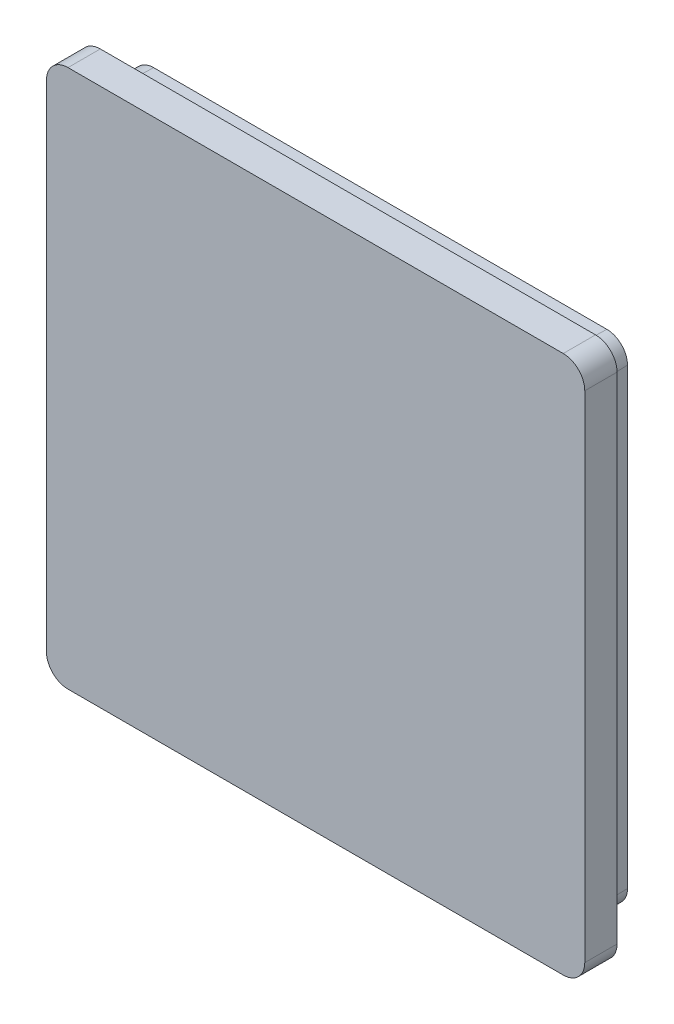
ISO-10303-21;
HEADER;
FILE_DESCRIPTION(('STEP AP214'),'2;1');
FILE_NAME('part.step','',(''),(''),'','','');
FILE_SCHEMA(('AUTOMOTIVE_DESIGN { 1 0 10303 214 1 1 1 1 }'));
ENDSEC;
DATA;
#1=APPLICATION_CONTEXT('core data for automotive mechanical design processes');
#2=APPLICATION_PROTOCOL_DEFINITION('international standard','automotive_design',2000,#1);
#3=PRODUCT_CONTEXT('',#1,'mechanical');
#4=PRODUCT('Part','Part','',(#3));
#5=PRODUCT_RELATED_PRODUCT_CATEGORY('part','',(#4));
#6=PRODUCT_DEFINITION_FORMATION('','',#4);
#7=PRODUCT_DEFINITION_CONTEXT('part definition',#1,'design');
#8=PRODUCT_DEFINITION('design','',#6,#7);
#9=PRODUCT_DEFINITION_SHAPE('','',#8);
#10=(LENGTH_UNIT() NAMED_UNIT(*) SI_UNIT(.MILLI.,.METRE.));
#11=(NAMED_UNIT(*) PLANE_ANGLE_UNIT() SI_UNIT($,.RADIAN.));
#12=(NAMED_UNIT(*) SI_UNIT($,.STERADIAN.) SOLID_ANGLE_UNIT());
#13=UNCERTAINTY_MEASURE_WITH_UNIT(LENGTH_MEASURE(1.E-05),#10,'distance_accuracy_value','');
#14=(GEOMETRIC_REPRESENTATION_CONTEXT(3) GLOBAL_UNCERTAINTY_ASSIGNED_CONTEXT((#13)) GLOBAL_UNIT_ASSIGNED_CONTEXT((#10,
#11,#12)) REPRESENTATION_CONTEXT('',''));
#15=CARTESIAN_POINT('',(0.,0.,0.));
#16=DIRECTION('',(0.,0.,1.));
#17=DIRECTION('',(1.,0.,0.));
#18=AXIS2_PLACEMENT_3D('',#15,#16,#17);
#19=CARTESIAN_POINT('',(23.,-23.,3.));
#20=DIRECTION('',(0.,0.,-1.));
#21=DIRECTION('',(-1.,0.,0.));
#22=AXIS2_PLACEMENT_3D('',#19,#20,#21);
#23=CYLINDRICAL_SURFACE('',#22,2.);
#24=CARTESIAN_POINT('',(23.,-23.,0.));
#25=DIRECTION('',(0.,0.,1.));
#26=DIRECTION('',(-1.,0.,0.));
#27=AXIS2_PLACEMENT_3D('',#24,#25,#26);
#28=CIRCLE('',#27,2.);
#29=CARTESIAN_POINT('',(23.,-25.,0.));
#30=VERTEX_POINT('',#29);
#31=CARTESIAN_POINT('',(25.,-23.,0.));
#32=VERTEX_POINT('',#31);
#33=EDGE_CURVE('E172',#30,#32,#28,.T.);
#34=ORIENTED_EDGE('',*,*,#33,.T.);
#35=DIRECTION('',(0.,0.,-1.));
#36=VECTOR('',#35,1.);
#37=CARTESIAN_POINT('',(25.,-23.,3.));
#38=LINE('',#37,#36);
#39=CARTESIAN_POINT('',(25.,-23.,3.));
#40=VERTEX_POINT('',#39);
#41=EDGE_CURVE('E11',#40,#32,#38,.T.);
#42=ORIENTED_EDGE('',*,*,#41,.F.);
#43=CARTESIAN_POINT('',(23.,-23.,3.));
#44=DIRECTION('',(0.,0.,1.));
#45=DIRECTION('',(-1.,0.,0.));
#46=AXIS2_PLACEMENT_3D('',#43,#44,#45);
#47=CIRCLE('',#46,2.);
#48=CARTESIAN_POINT('',(23.,-25.,3.));
#49=VERTEX_POINT('',#48);
#50=EDGE_CURVE('E195',#49,#40,#47,.T.);
#51=ORIENTED_EDGE('',*,*,#50,.F.);
#52=DIRECTION('',(0.,0.,-1.));
#53=VECTOR('',#52,1.);
#54=CARTESIAN_POINT('',(23.,-25.,3.));
#55=LINE('',#54,#53);
#56=EDGE_CURVE('E213',#49,#30,#55,.T.);
#57=ORIENTED_EDGE('',*,*,#56,.T.);
#58=EDGE_LOOP('',(#34,#42,#51,#57));
#59=FACE_BOUND('',#58,.T.);
#60=ADVANCED_FACE('F39',(#59),#23,.T.);
#61=CARTESIAN_POINT('',(25.,-23.,3.));
#62=DIRECTION('',(-1.,0.,0.));
#63=DIRECTION('',(0.,0.,1.));
#64=AXIS2_PLACEMENT_3D('',#61,#62,#63);
#65=PLANE('',#64);
#66=DIRECTION('',(0.,1.,0.));
#67=VECTOR('',#66,1.);
#68=CARTESIAN_POINT('',(25.,-23.,0.));
#69=LINE('',#68,#67);
#70=CARTESIAN_POINT('',(25.,23.,0.));
#71=VERTEX_POINT('',#70);
#72=EDGE_CURVE('E216',#32,#71,#69,.T.);
#73=ORIENTED_EDGE('',*,*,#72,.T.);
#74=DIRECTION('',(0.,0.,-1.));
#75=VECTOR('',#74,1.);
#76=CARTESIAN_POINT('',(25.,23.,3.));
#77=LINE('',#76,#75);
#78=CARTESIAN_POINT('',(25.,23.,3.));
#79=VERTEX_POINT('',#78);
#80=EDGE_CURVE('E46',#79,#71,#77,.T.);
#81=ORIENTED_EDGE('',*,*,#80,.F.);
#82=DIRECTION('',(0.,1.,0.));
#83=VECTOR('',#82,1.);
#84=CARTESIAN_POINT('',(25.,-23.,3.));
#85=LINE('',#84,#83);
#86=EDGE_CURVE('E198',#40,#79,#85,.T.);
#87=ORIENTED_EDGE('',*,*,#86,.F.);
#88=ORIENTED_EDGE('',*,*,#41,.T.);
#89=EDGE_LOOP('',(#73,#81,#87,#88));
#90=FACE_BOUND('',#89,.T.);
#91=ADVANCED_FACE('F271',(#90),#65,.F.);
#92=CARTESIAN_POINT('',(23.,23.,3.));
#93=DIRECTION('',(0.,0.,-1.));
#94=DIRECTION('',(-1.,0.,0.));
#95=AXIS2_PLACEMENT_3D('',#92,#93,#94);
#96=CYLINDRICAL_SURFACE('',#95,2.);
#97=CARTESIAN_POINT('',(23.,23.,0.));
#98=DIRECTION('',(0.,0.,1.));
#99=DIRECTION('',(1.,0.,0.));
#100=AXIS2_PLACEMENT_3D('',#97,#98,#99);
#101=CIRCLE('',#100,2.);
#102=CARTESIAN_POINT('',(23.,25.,0.));
#103=VERTEX_POINT('',#102);
#104=EDGE_CURVE('E218',#71,#103,#101,.T.);
#105=ORIENTED_EDGE('',*,*,#104,.T.);
#106=DIRECTION('',(0.,0.,-1.));
#107=VECTOR('',#106,1.);
#108=CARTESIAN_POINT('',(23.,25.,3.));
#109=LINE('',#108,#107);
#110=CARTESIAN_POINT('',(23.,25.,3.));
#111=VERTEX_POINT('',#110);
#112=EDGE_CURVE('E243',#111,#103,#109,.T.);
#113=ORIENTED_EDGE('',*,*,#112,.F.);
#114=CARTESIAN_POINT('',(23.,23.,3.));
#115=DIRECTION('',(0.,0.,1.));
#116=DIRECTION('',(1.,0.,0.));
#117=AXIS2_PLACEMENT_3D('',#114,#115,#116);
#118=CIRCLE('',#117,2.);
#119=EDGE_CURVE('E201',#79,#111,#118,.T.);
#120=ORIENTED_EDGE('',*,*,#119,.F.);
#121=ORIENTED_EDGE('',*,*,#80,.T.);
#122=EDGE_LOOP('',(#105,#113,#120,#121));
#123=FACE_BOUND('',#122,.T.);
#124=ADVANCED_FACE('F250',(#123),#96,.T.);
#125=CARTESIAN_POINT('',(23.,25.,3.));
#126=DIRECTION('',(0.,-1.,0.));
#127=DIRECTION('',(0.,0.,-1.));
#128=AXIS2_PLACEMENT_3D('',#125,#126,#127);
#129=PLANE('',#128);
#130=DIRECTION('',(-1.,0.,0.));
#131=VECTOR('',#130,1.);
#132=CARTESIAN_POINT('',(23.,25.,0.));
#133=LINE('',#132,#131);
#134=CARTESIAN_POINT('',(-23.,25.,0.));
#135=VERTEX_POINT('',#134);
#136=EDGE_CURVE('E220',#103,#135,#133,.T.);
#137=ORIENTED_EDGE('',*,*,#136,.T.);
#138=DIRECTION('',(0.,0.,-1.));
#139=VECTOR('',#138,1.);
#140=CARTESIAN_POINT('',(-23.,25.,3.));
#141=LINE('',#140,#139);
#142=CARTESIAN_POINT('',(-23.,25.,3.));
#143=VERTEX_POINT('',#142);
#144=EDGE_CURVE('E240',#143,#135,#141,.T.);
#145=ORIENTED_EDGE('',*,*,#144,.F.);
#146=DIRECTION('',(-1.,0.,0.));
#147=VECTOR('',#146,1.);
#148=CARTESIAN_POINT('',(23.,25.,3.));
#149=LINE('',#148,#147);
#150=EDGE_CURVE('E203',#111,#143,#149,.T.);
#151=ORIENTED_EDGE('',*,*,#150,.F.);
#152=ORIENTED_EDGE('',*,*,#112,.T.);
#153=EDGE_LOOP('',(#137,#145,#151,#152));
#154=FACE_BOUND('',#153,.T.);
#155=ADVANCED_FACE('F259',(#154),#129,.F.);
#156=CARTESIAN_POINT('',(-23.,23.,3.));
#157=DIRECTION('',(0.,0.,-1.));
#158=DIRECTION('',(-1.,0.,0.));
#159=AXIS2_PLACEMENT_3D('',#156,#157,#158);
#160=CYLINDRICAL_SURFACE('',#159,2.);
#161=CARTESIAN_POINT('',(-23.,23.,0.));
#162=DIRECTION('',(0.,0.,1.));
#163=DIRECTION('',(-1.,0.,0.));
#164=AXIS2_PLACEMENT_3D('',#161,#162,#163);
#165=CIRCLE('',#164,2.);
#166=CARTESIAN_POINT('',(-25.,23.,0.));
#167=VERTEX_POINT('',#166);
#168=EDGE_CURVE('E222',#135,#167,#165,.T.);
#169=ORIENTED_EDGE('',*,*,#168,.T.);
#170=DIRECTION('',(0.,0.,-1.));
#171=VECTOR('',#170,1.);
#172=CARTESIAN_POINT('',(-25.,23.,3.));
#173=LINE('',#172,#171);
#174=CARTESIAN_POINT('',(-25.,23.,3.));
#175=VERTEX_POINT('',#174);
#176=EDGE_CURVE('E237',#175,#167,#173,.T.);
#177=ORIENTED_EDGE('',*,*,#176,.F.);
#178=CARTESIAN_POINT('',(-23.,23.,3.));
#179=DIRECTION('',(0.,0.,1.));
#180=DIRECTION('',(-1.,0.,0.));
#181=AXIS2_PLACEMENT_3D('',#178,#179,#180);
#182=CIRCLE('',#181,2.);
#183=EDGE_CURVE('E205',#143,#175,#182,.T.);
#184=ORIENTED_EDGE('',*,*,#183,.F.);
#185=ORIENTED_EDGE('',*,*,#144,.T.);
#186=EDGE_LOOP('',(#169,#177,#184,#185));
#187=FACE_BOUND('',#186,.T.);
#188=ADVANCED_FACE('F263',(#187),#160,.T.);
#189=CARTESIAN_POINT('',(-25.,-23.,3.));
#190=DIRECTION('',(1.,0.,0.));
#191=DIRECTION('',(0.,0.,-1.));
#192=AXIS2_PLACEMENT_3D('',#189,#190,#191);
#193=PLANE('',#192);
#194=DIRECTION('',(0.,-1.,0.));
#195=VECTOR('',#194,1.);
#196=CARTESIAN_POINT('',(-25.,-23.,0.));
#197=LINE('',#196,#195);
#198=CARTESIAN_POINT('',(-25.,-23.,0.));
#199=VERTEX_POINT('',#198);
#200=EDGE_CURVE('E224',#167,#199,#197,.T.);
#201=ORIENTED_EDGE('',*,*,#200,.T.);
#202=DIRECTION('',(0.,0.,-1.));
#203=VECTOR('',#202,1.);
#204=CARTESIAN_POINT('',(-25.,-23.,3.));
#205=LINE('',#204,#203);
#206=CARTESIAN_POINT('',(-25.,-23.,3.));
#207=VERTEX_POINT('',#206);
#208=EDGE_CURVE('E234',#207,#199,#205,.T.);
#209=ORIENTED_EDGE('',*,*,#208,.F.);
#210=DIRECTION('',(0.,-1.,0.));
#211=VECTOR('',#210,1.);
#212=CARTESIAN_POINT('',(-25.,-23.,3.));
#213=LINE('',#212,#211);
#214=EDGE_CURVE('E207',#175,#207,#213,.T.);
#215=ORIENTED_EDGE('',*,*,#214,.F.);
#216=ORIENTED_EDGE('',*,*,#176,.T.);
#217=EDGE_LOOP('',(#201,#209,#215,#216));
#218=FACE_BOUND('',#217,.T.);
#219=ADVANCED_FACE('F284',(#218),#193,.F.);
#220=CARTESIAN_POINT('',(-23.,-23.,3.));
#221=DIRECTION('',(0.,0.,-1.));
#222=DIRECTION('',(-1.,0.,0.));
#223=AXIS2_PLACEMENT_3D('',#220,#221,#222);
#224=CYLINDRICAL_SURFACE('',#223,2.);
#225=CARTESIAN_POINT('',(-23.,-23.,0.));
#226=DIRECTION('',(0.,0.,1.));
#227=DIRECTION('',(-1.,0.,0.));
#228=AXIS2_PLACEMENT_3D('',#225,#226,#227);
#229=CIRCLE('',#228,2.);
#230=CARTESIAN_POINT('',(-23.,-25.,0.));
#231=VERTEX_POINT('',#230);
#232=EDGE_CURVE('E226',#199,#231,#229,.T.);
#233=ORIENTED_EDGE('',*,*,#232,.T.);
#234=DIRECTION('',(0.,0.,-1.));
#235=VECTOR('',#234,1.);
#236=CARTESIAN_POINT('',(-23.,-25.,3.));
#237=LINE('',#236,#235);
#238=CARTESIAN_POINT('',(-23.,-25.,3.));
#239=VERTEX_POINT('',#238);
#240=EDGE_CURVE('E231',#239,#231,#237,.T.);
#241=ORIENTED_EDGE('',*,*,#240,.F.);
#242=CARTESIAN_POINT('',(-23.,-23.,3.));
#243=DIRECTION('',(0.,0.,1.));
#244=DIRECTION('',(-1.,0.,0.));
#245=AXIS2_PLACEMENT_3D('',#242,#243,#244);
#246=CIRCLE('',#245,2.);
#247=EDGE_CURVE('E209',#207,#239,#246,.T.);
#248=ORIENTED_EDGE('',*,*,#247,.F.);
#249=ORIENTED_EDGE('',*,*,#208,.T.);
#250=EDGE_LOOP('',(#233,#241,#248,#249));
#251=FACE_BOUND('',#250,.T.);
#252=ADVANCED_FACE('F282',(#251),#224,.T.);
#253=CARTESIAN_POINT('',(23.,-25.,3.));
#254=DIRECTION('',(0.,1.,0.));
#255=DIRECTION('',(0.,0.,1.));
#256=AXIS2_PLACEMENT_3D('',#253,#254,#255);
#257=PLANE('',#256);
#258=DIRECTION('',(1.,0.,0.));
#259=VECTOR('',#258,1.);
#260=CARTESIAN_POINT('',(23.,-25.,0.));
#261=LINE('',#260,#259);
#262=EDGE_CURVE('E199',#231,#30,#261,.T.);
#263=ORIENTED_EDGE('',*,*,#262,.T.);
#264=ORIENTED_EDGE('',*,*,#56,.F.);
#265=DIRECTION('',(1.,0.,0.));
#266=VECTOR('',#265,1.);
#267=CARTESIAN_POINT('',(23.,-25.,3.));
#268=LINE('',#267,#266);
#269=EDGE_CURVE('E211',#239,#49,#268,.T.);
#270=ORIENTED_EDGE('',*,*,#269,.F.);
#271=ORIENTED_EDGE('',*,*,#240,.T.);
#272=EDGE_LOOP('',(#263,#264,#270,#271));
#273=FACE_BOUND('',#272,.T.);
#274=ADVANCED_FACE('F277',(#273),#257,.F.);
#275=CARTESIAN_POINT('',(23.,-23.,3.));
#276=DIRECTION('',(0.,0.,-1.));
#277=DIRECTION('',(-1.,0.,0.));
#278=AXIS2_PLACEMENT_3D('',#275,#276,#277);
#279=PLANE('',#278);
#280=ORIENTED_EDGE('',*,*,#50,.T.);
#281=ORIENTED_EDGE('',*,*,#86,.T.);
#282=ORIENTED_EDGE('',*,*,#119,.T.);
#283=ORIENTED_EDGE('',*,*,#150,.T.);
#284=ORIENTED_EDGE('',*,*,#183,.T.);
#285=ORIENTED_EDGE('',*,*,#214,.T.);
#286=ORIENTED_EDGE('',*,*,#247,.T.);
#287=ORIENTED_EDGE('',*,*,#269,.T.);
#288=EDGE_LOOP('',(#280,#281,#282,#283,#284,#285,#286,#287));
#289=FACE_BOUND('',#288,.T.);
#290=ADVANCED_FACE('F267',(#289),#279,.F.);
#291=CARTESIAN_POINT('',(23.,-23.,0.));
#292=DIRECTION('',(0.,0.,-1.));
#293=DIRECTION('',(-1.,0.,0.));
#294=AXIS2_PLACEMENT_3D('',#291,#292,#293);
#295=PLANE('',#294);
#296=CARTESIAN_POINT('',(21.05,21.05,0.));
#297=DIRECTION('',(0.,0.,-1.));
#298=DIRECTION('',(-1.,0.,0.));
#299=AXIS2_PLACEMENT_3D('',#296,#297,#298);
#300=CIRCLE('',#299,2.);
#301=CARTESIAN_POINT('',(21.05,23.05,0.));
#302=VERTEX_POINT('',#301);
#303=CARTESIAN_POINT('',(23.05,21.05,0.));
#304=VERTEX_POINT('',#303);
#305=EDGE_CURVE('E53',#302,#304,#300,.T.);
#306=ORIENTED_EDGE('',*,*,#305,.F.);
#307=DIRECTION('',(1.,0.,0.));
#308=VECTOR('',#307,1.);
#309=CARTESIAN_POINT('',(-21.05,23.05,0.));
#310=LINE('',#309,#308);
#311=CARTESIAN_POINT('',(-21.05,23.05,0.));
#312=VERTEX_POINT('',#311);
#313=EDGE_CURVE('E57',#312,#302,#310,.T.);
#314=ORIENTED_EDGE('',*,*,#313,.F.);
#315=CARTESIAN_POINT('',(-21.05,21.05,0.));
#316=DIRECTION('',(0.,0.,-1.));
#317=DIRECTION('',(1.,0.,0.));
#318=AXIS2_PLACEMENT_3D('',#315,#316,#317);
#319=CIRCLE('',#318,2.);
#320=CARTESIAN_POINT('',(-23.05,21.05,0.));
#321=VERTEX_POINT('',#320);
#322=EDGE_CURVE('E449',#321,#312,#319,.T.);
#323=ORIENTED_EDGE('',*,*,#322,.F.);
#324=DIRECTION('',(0.,1.,0.));
#325=VECTOR('',#324,1.);
#326=CARTESIAN_POINT('',(-23.05,21.05,0.));
#327=LINE('',#326,#325);
#328=CARTESIAN_POINT('',(-23.05,-21.05,0.));
#329=VERTEX_POINT('',#328);
#330=EDGE_CURVE('E446',#329,#321,#327,.T.);
#331=ORIENTED_EDGE('',*,*,#330,.F.);
#332=CARTESIAN_POINT('',(-21.05,-21.05,0.));
#333=DIRECTION('',(0.,0.,-1.));
#334=DIRECTION('',(1.,0.,0.));
#335=AXIS2_PLACEMENT_3D('',#332,#333,#334);
#336=CIRCLE('',#335,2.);
#337=CARTESIAN_POINT('',(-21.05,-23.05,0.));
#338=VERTEX_POINT('',#337);
#339=EDGE_CURVE('E443',#338,#329,#336,.T.);
#340=ORIENTED_EDGE('',*,*,#339,.F.);
#341=DIRECTION('',(-1.,0.,0.));
#342=VECTOR('',#341,1.);
#343=CARTESIAN_POINT('',(-21.05,-23.05,0.));
#344=LINE('',#343,#342);
#345=CARTESIAN_POINT('',(21.05,-23.05,0.));
#346=VERTEX_POINT('',#345);
#347=EDGE_CURVE('E154',#346,#338,#344,.T.);
#348=ORIENTED_EDGE('',*,*,#347,.F.);
#349=CARTESIAN_POINT('',(21.05,-21.05,0.));
#350=DIRECTION('',(0.,0.,-1.));
#351=DIRECTION('',(1.,0.,0.));
#352=AXIS2_PLACEMENT_3D('',#349,#350,#351);
#353=CIRCLE('',#352,2.);
#354=CARTESIAN_POINT('',(23.05,-21.05,0.));
#355=VERTEX_POINT('',#354);
#356=EDGE_CURVE('E147',#355,#346,#353,.T.);
#357=ORIENTED_EDGE('',*,*,#356,.F.);
#358=DIRECTION('',(0.,-1.,0.));
#359=VECTOR('',#358,1.);
#360=CARTESIAN_POINT('',(23.05,21.05,0.));
#361=LINE('',#360,#359);
#362=EDGE_CURVE('E151',#304,#355,#361,.T.);
#363=ORIENTED_EDGE('',*,*,#362,.F.);
#364=EDGE_LOOP('',(#306,#314,#323,#331,#340,#348,#357,#363));
#365=FACE_BOUND('',#364,.T.);
#366=ORIENTED_EDGE('',*,*,#33,.F.);
#367=ORIENTED_EDGE('',*,*,#262,.F.);
#368=ORIENTED_EDGE('',*,*,#232,.F.);
#369=ORIENTED_EDGE('',*,*,#200,.F.);
#370=ORIENTED_EDGE('',*,*,#168,.F.);
#371=ORIENTED_EDGE('',*,*,#136,.F.);
#372=ORIENTED_EDGE('',*,*,#104,.F.);
#373=ORIENTED_EDGE('',*,*,#72,.F.);
#374=EDGE_LOOP('',(#366,#367,#368,#369,#370,#371,#372,#373));
#375=FACE_BOUND('',#374,.T.);
#376=ADVANCED_FACE('F149',(#365,#375),#295,.T.);
#377=CARTESIAN_POINT('',(21.05,21.05,0.));
#378=DIRECTION('',(0.,0.,1.));
#379=DIRECTION('',(-1.,0.,0.));
#380=AXIS2_PLACEMENT_3D('',#377,#378,#379);
#381=CONICAL_SURFACE('',#380,2.,0.026179938779915);
#382=ORIENTED_EDGE('',*,*,#305,.T.);
#383=DIRECTION('',(0.0261769483078732,0.,0.999657324975557));
#384=VECTOR('',#383,1.);
#385=CARTESIAN_POINT('',(23.05,21.05,0.));
#386=LINE('',#385,#384);
#387=CARTESIAN_POINT('',(22.9714422352924,21.05,-3.));
#388=VERTEX_POINT('',#387);
#389=EDGE_CURVE('E166',#388,#304,#386,.T.);
#390=ORIENTED_EDGE('',*,*,#389,.F.);
#391=CARTESIAN_POINT('',(21.05,21.05,-3.));
#392=DIRECTION('',(0.,0.,-1.));
#393=DIRECTION('',(-1.,0.,0.));
#394=AXIS2_PLACEMENT_3D('',#391,#392,#393);
#395=CIRCLE('',#394,1.92144223529244);
#396=CARTESIAN_POINT('',(21.05,22.9714422352924,-3.));
#397=VERTEX_POINT('',#396);
#398=EDGE_CURVE('E178',#397,#388,#395,.T.);
#399=ORIENTED_EDGE('',*,*,#398,.F.);
#400=DIRECTION('',(0.,0.0261769483078732,0.999657324975557));
#401=VECTOR('',#400,1.);
#402=CARTESIAN_POINT('',(21.05,23.05,0.));
#403=LINE('',#402,#401);
#404=EDGE_CURVE('E194',#397,#302,#403,.T.);
#405=ORIENTED_EDGE('',*,*,#404,.T.);
#406=EDGE_LOOP('',(#382,#390,#399,#405));
#407=FACE_BOUND('',#406,.T.);
#408=ADVANCED_FACE('F348',(#407),#381,.T.);
#409=CARTESIAN_POINT('',(23.05,21.05,0.));
#410=DIRECTION('',(0.999657324975557,0.,-0.0261769483078732));
#411=DIRECTION('',(-0.0261769483078732,0.,-0.999657324975557));
#412=AXIS2_PLACEMENT_3D('',#409,#410,#411);
#413=PLANE('',#412);
#414=ORIENTED_EDGE('',*,*,#362,.T.);
#415=DIRECTION('',(0.0261769483078732,0.,0.999657324975557));
#416=VECTOR('',#415,1.);
#417=CARTESIAN_POINT('',(23.05,-21.05,0.));
#418=LINE('',#417,#416);
#419=CARTESIAN_POINT('',(22.9714422352924,-21.05,-3.));
#420=VERTEX_POINT('',#419);
#421=EDGE_CURVE('E163',#420,#355,#418,.T.);
#422=ORIENTED_EDGE('',*,*,#421,.F.);
#423=DIRECTION('',(0.,1.,0.));
#424=VECTOR('',#423,1.);
#425=CARTESIAN_POINT('',(22.9714422352924,21.05,-3.));
#426=LINE('',#425,#424);
#427=EDGE_CURVE('E181',#388,#420,#426,.F.);
#428=ORIENTED_EDGE('',*,*,#427,.F.);
#429=ORIENTED_EDGE('',*,*,#389,.T.);
#430=EDGE_LOOP('',(#414,#422,#428,#429));
#431=FACE_BOUND('',#430,.T.);
#432=ADVANCED_FACE('F162',(#431),#413,.T.);
#433=CARTESIAN_POINT('',(21.05,-21.05,0.));
#434=DIRECTION('',(0.,0.,1.));
#435=DIRECTION('',(1.,0.,0.));
#436=AXIS2_PLACEMENT_3D('',#433,#434,#435);
#437=CONICAL_SURFACE('',#436,2.,0.026179938779915);
#438=ORIENTED_EDGE('',*,*,#356,.T.);
#439=DIRECTION('',(0.,-0.0261769483078732,0.999657324975557));
#440=VECTOR('',#439,1.);
#441=CARTESIAN_POINT('',(21.05,-23.05,0.));
#442=LINE('',#441,#440);
#443=CARTESIAN_POINT('',(21.05,-22.9714422352924,-3.));
#444=VERTEX_POINT('',#443);
#445=EDGE_CURVE('E170',#444,#346,#442,.T.);
#446=ORIENTED_EDGE('',*,*,#445,.F.);
#447=CARTESIAN_POINT('',(21.05,-21.05,-3.));
#448=DIRECTION('',(0.,0.,-1.));
#449=DIRECTION('',(-1.,0.,0.));
#450=AXIS2_PLACEMENT_3D('',#447,#448,#449);
#451=CIRCLE('',#450,1.92144223529244);
#452=EDGE_CURVE('E169',#420,#444,#451,.T.);
#453=ORIENTED_EDGE('',*,*,#452,.F.);
#454=ORIENTED_EDGE('',*,*,#421,.T.);
#455=EDGE_LOOP('',(#438,#446,#453,#454));
#456=FACE_BOUND('',#455,.T.);
#457=ADVANCED_FACE('F168',(#456),#437,.T.);
#458=CARTESIAN_POINT('',(-21.05,-23.05,0.));
#459=DIRECTION('',(0.,-0.999657324975557,-0.0261769483078732));
#460=DIRECTION('',(0.,0.0261769483078732,-0.999657324975557));
#461=AXIS2_PLACEMENT_3D('',#458,#459,#460);
#462=PLANE('',#461);
#463=ORIENTED_EDGE('',*,*,#347,.T.);
#464=DIRECTION('',(0.,-0.0261769483078732,0.999657324975557));
#465=VECTOR('',#464,1.);
#466=CARTESIAN_POINT('',(-21.05,-23.05,0.));
#467=LINE('',#466,#465);
#468=CARTESIAN_POINT('',(-21.05,-22.9714422352924,-3.));
#469=VERTEX_POINT('',#468);
#470=EDGE_CURVE('E174',#469,#338,#467,.T.);
#471=ORIENTED_EDGE('',*,*,#470,.F.);
#472=DIRECTION('',(1.,0.,0.));
#473=VECTOR('',#472,1.);
#474=CARTESIAN_POINT('',(-21.05,-22.9714422352924,-3.));
#475=LINE('',#474,#473);
#476=EDGE_CURVE('E184',#444,#469,#475,.F.);
#477=ORIENTED_EDGE('',*,*,#476,.F.);
#478=ORIENTED_EDGE('',*,*,#445,.T.);
#479=EDGE_LOOP('',(#463,#471,#477,#478));
#480=FACE_BOUND('',#479,.T.);
#481=ADVANCED_FACE('F374',(#480),#462,.T.);
#482=CARTESIAN_POINT('',(-21.05,-21.05,0.));
#483=DIRECTION('',(0.,0.,1.));
#484=DIRECTION('',(1.,0.,0.));
#485=AXIS2_PLACEMENT_3D('',#482,#483,#484);
#486=CONICAL_SURFACE('',#485,2.,0.026179938779915);
#487=ORIENTED_EDGE('',*,*,#339,.T.);
#488=DIRECTION('',(-0.0261769483078732,0.,0.999657324975557));
#489=VECTOR('',#488,1.);
#490=CARTESIAN_POINT('',(-23.05,-21.05,0.));
#491=LINE('',#490,#489);
#492=CARTESIAN_POINT('',(-22.9714422352924,-21.05,-3.));
#493=VERTEX_POINT('',#492);
#494=EDGE_CURVE('E459',#493,#329,#491,.T.);
#495=ORIENTED_EDGE('',*,*,#494,.F.);
#496=CARTESIAN_POINT('',(-21.05,-21.05,-3.));
#497=DIRECTION('',(0.,0.,-1.));
#498=DIRECTION('',(-1.,0.,0.));
#499=AXIS2_PLACEMENT_3D('',#496,#497,#498);
#500=CIRCLE('',#499,1.92144223529244);
#501=EDGE_CURVE('E186',#469,#493,#500,.T.);
#502=ORIENTED_EDGE('',*,*,#501,.F.);
#503=ORIENTED_EDGE('',*,*,#470,.T.);
#504=EDGE_LOOP('',(#487,#495,#502,#503));
#505=FACE_BOUND('',#504,.T.);
#506=ADVANCED_FACE('F383',(#505),#486,.T.);
#507=CARTESIAN_POINT('',(-23.05,21.05,0.));
#508=DIRECTION('',(-0.999657324975557,0.,-0.0261769483078732));
#509=DIRECTION('',(-0.0261769483078732,0.,0.999657324975557));
#510=AXIS2_PLACEMENT_3D('',#507,#508,#509);
#511=PLANE('',#510);
#512=ORIENTED_EDGE('',*,*,#330,.T.);
#513=DIRECTION('',(-0.0261769483078732,0.,0.999657324975557));
#514=VECTOR('',#513,1.);
#515=CARTESIAN_POINT('',(-23.05,21.05,0.));
#516=LINE('',#515,#514);
#517=CARTESIAN_POINT('',(-22.9714422352924,21.05,-3.));
#518=VERTEX_POINT('',#517);
#519=EDGE_CURVE('E456',#518,#321,#516,.T.);
#520=ORIENTED_EDGE('',*,*,#519,.F.);
#521=DIRECTION('',(0.,-1.,0.));
#522=VECTOR('',#521,1.);
#523=CARTESIAN_POINT('',(-22.9714422352924,21.05,-3.));
#524=LINE('',#523,#522);
#525=EDGE_CURVE('E188',#493,#518,#524,.F.);
#526=ORIENTED_EDGE('',*,*,#525,.F.);
#527=ORIENTED_EDGE('',*,*,#494,.T.);
#528=EDGE_LOOP('',(#512,#520,#526,#527));
#529=FACE_BOUND('',#528,.T.);
#530=ADVANCED_FACE('F393',(#529),#511,.T.);
#531=CARTESIAN_POINT('',(-21.05,21.05,0.));
#532=DIRECTION('',(0.,0.,1.));
#533=DIRECTION('',(1.,0.,0.));
#534=AXIS2_PLACEMENT_3D('',#531,#532,#533);
#535=CONICAL_SURFACE('',#534,2.,0.026179938779915);
#536=ORIENTED_EDGE('',*,*,#322,.T.);
#537=DIRECTION('',(0.,0.0261769483078732,0.999657324975557));
#538=VECTOR('',#537,1.);
#539=CARTESIAN_POINT('',(-21.05,23.05,0.));
#540=LINE('',#539,#538);
#541=CARTESIAN_POINT('',(-21.05,22.9714422352924,-3.));
#542=VERTEX_POINT('',#541);
#543=EDGE_CURVE('E453',#542,#312,#540,.T.);
#544=ORIENTED_EDGE('',*,*,#543,.F.);
#545=CARTESIAN_POINT('',(-21.05,21.05,-3.));
#546=DIRECTION('',(0.,0.,-1.));
#547=DIRECTION('',(-1.,0.,0.));
#548=AXIS2_PLACEMENT_3D('',#545,#546,#547);
#549=CIRCLE('',#548,1.92144223529244);
#550=EDGE_CURVE('E190',#518,#542,#549,.T.);
#551=ORIENTED_EDGE('',*,*,#550,.F.);
#552=ORIENTED_EDGE('',*,*,#519,.T.);
#553=EDGE_LOOP('',(#536,#544,#551,#552));
#554=FACE_BOUND('',#553,.T.);
#555=ADVANCED_FACE('F403',(#554),#535,.T.);
#556=CARTESIAN_POINT('',(-21.05,23.05,0.));
#557=DIRECTION('',(0.,0.999657324975557,-0.0261769483078732));
#558=DIRECTION('',(0.,0.0261769483078732,0.999657324975557));
#559=AXIS2_PLACEMENT_3D('',#556,#557,#558);
#560=PLANE('',#559);
#561=ORIENTED_EDGE('',*,*,#313,.T.);
#562=ORIENTED_EDGE('',*,*,#404,.F.);
#563=DIRECTION('',(-1.,0.,0.));
#564=VECTOR('',#563,1.);
#565=CARTESIAN_POINT('',(-21.05,22.9714422352924,-3.));
#566=LINE('',#565,#564);
#567=EDGE_CURVE('E192',#542,#397,#566,.F.);
#568=ORIENTED_EDGE('',*,*,#567,.F.);
#569=ORIENTED_EDGE('',*,*,#543,.T.);
#570=EDGE_LOOP('',(#561,#562,#568,#569));
#571=FACE_BOUND('',#570,.T.);
#572=ADVANCED_FACE('F413',(#571),#560,.T.);
#573=CARTESIAN_POINT('',(21.05,21.05,-3.));
#574=DIRECTION('',(0.,0.,-1.));
#575=DIRECTION('',(-1.,0.,0.));
#576=AXIS2_PLACEMENT_3D('',#573,#574,#575);
#577=PLANE('',#576);
#578=ORIENTED_EDGE('',*,*,#398,.T.);
#579=ORIENTED_EDGE('',*,*,#427,.T.);
#580=ORIENTED_EDGE('',*,*,#452,.T.);
#581=ORIENTED_EDGE('',*,*,#476,.T.);
#582=ORIENTED_EDGE('',*,*,#501,.T.);
#583=ORIENTED_EDGE('',*,*,#525,.T.);
#584=ORIENTED_EDGE('',*,*,#550,.T.);
#585=ORIENTED_EDGE('',*,*,#567,.T.);
#586=EDGE_LOOP('',(#578,#579,#580,#581,#582,#583,#584,#585));
#587=FACE_BOUND('',#586,.T.);
#588=ADVANCED_FACE('F423',(#587),#577,.T.);
#589=CLOSED_SHELL('',(#60,#91,#124,#155,#188,#219,#252,#274,#290,#376,#408,#432,#457,#481,#506,
#530,#555,#572,#588));
#590=MANIFOLD_SOLID_BREP('B2',#589);
#591=ADVANCED_BREP_SHAPE_REPRESENTATION('',(#18,#590),#14);
#592=SHAPE_DEFINITION_REPRESENTATION(#9,#591);
ENDSEC;
END-ISO-10303-21;
